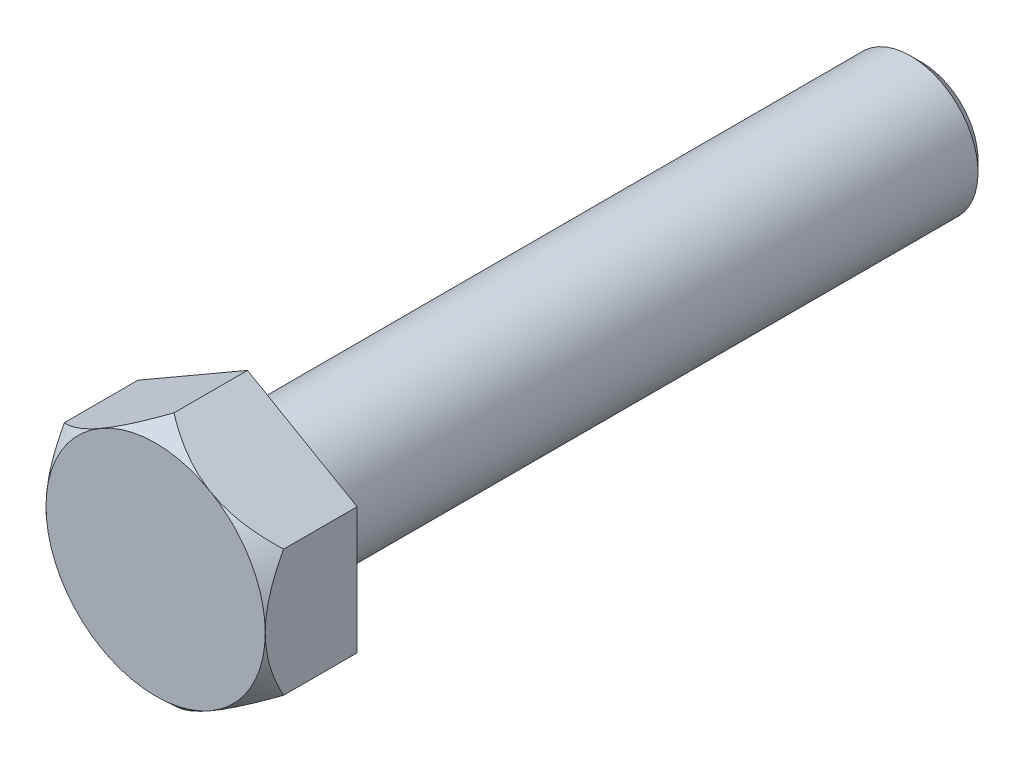
ISO-10303-21;
HEADER;
FILE_DESCRIPTION(('STEP AP214'),'2;1');
FILE_NAME('part.step','',(''),(''),'','','');
FILE_SCHEMA(('AUTOMOTIVE_DESIGN { 1 0 10303 214 1 1 1 1 }'));
ENDSEC;
DATA;
#1=APPLICATION_CONTEXT('core data for automotive mechanical design processes');
#2=APPLICATION_PROTOCOL_DEFINITION('international standard','automotive_design',2000,#1);
#3=PRODUCT_CONTEXT('',#1,'mechanical');
#4=PRODUCT('Part','Part','',(#3));
#5=PRODUCT_RELATED_PRODUCT_CATEGORY('part','',(#4));
#6=PRODUCT_DEFINITION_FORMATION('','',#4);
#7=PRODUCT_DEFINITION_CONTEXT('part definition',#1,'design');
#8=PRODUCT_DEFINITION('design','',#6,#7);
#9=PRODUCT_DEFINITION_SHAPE('','',#8);
#10=(LENGTH_UNIT() NAMED_UNIT(*) SI_UNIT(.MILLI.,.METRE.));
#11=(NAMED_UNIT(*) PLANE_ANGLE_UNIT() SI_UNIT($,.RADIAN.));
#12=(NAMED_UNIT(*) SI_UNIT($,.STERADIAN.) SOLID_ANGLE_UNIT());
#13=UNCERTAINTY_MEASURE_WITH_UNIT(LENGTH_MEASURE(1.E-05),#10,'distance_accuracy_value','');
#14=(GEOMETRIC_REPRESENTATION_CONTEXT(3) GLOBAL_UNCERTAINTY_ASSIGNED_CONTEXT((#13)) GLOBAL_UNIT_ASSIGNED_CONTEXT((#10,
#11,#12)) REPRESENTATION_CONTEXT('',''));
#15=CARTESIAN_POINT('',(0.,0.,0.));
#16=DIRECTION('',(0.,0.,1.));
#17=DIRECTION('',(1.,0.,0.));
#18=AXIS2_PLACEMENT_3D('',#15,#16,#17);
#19=CARTESIAN_POINT('',(3.25,-5.62916512459885,5.45));
#20=DIRECTION('',(0.5,-0.866025403784439,0.));
#21=DIRECTION('',(0.,0.,-1.));
#22=AXIS2_PLACEMENT_3D('',#19,#20,#21);
#23=PLANE('',#22);
#24=CARTESIAN_POINT('',(6.49999393874435,-3.75278024920014,4.36));
#25=CARTESIAN_POINT('',(4.758327813034,-4.75833165571749,5.45));
#26=CARTESIAN_POINT('',(3.25,-5.62916512459885,5.45));
#27=CARTESIAN_POINT('',(1.741672186966,-6.49999859348023,5.45));
#28=CARTESIAN_POINT('',(6.06125564464485E-06,-7.50554999999756,4.36));
#29=(BOUNDED_CURVE() B_SPLINE_CURVE(2,(#24,#25,#26,#27,#28),.UNSPECIFIED.,.F.,
.F.) B_SPLINE_CURVE_WITH_KNOTS((3,2,3),(0.,3.93923247027006,7.87846494054012),
.UNSPECIFIED.) CURVE() GEOMETRIC_REPRESENTATION_ITEM() RATIONAL_B_SPLINE_CURVE((1.,
1.03795471962895,1.,1.03795471962895,1.)) REPRESENTATION_ITEM(''));
#30=CARTESIAN_POINT('',(3.25,-5.62916512459885,5.45));
#31=VERTEX_POINT('',#30);
#32=CARTESIAN_POINT('',(6.06125564912523E-06,-7.50554999999755,4.36));
#33=VERTEX_POINT('',#32);
#34=EDGE_CURVE('E245',#31,#33,#29,.T.);
#35=ORIENTED_EDGE('',*,*,#34,.T.);
#36=DIRECTION('',(0.,0.,-1.));
#37=VECTOR('',#36,1.);
#38=CARTESIAN_POINT('',(6.06125564925871E-06,-7.50554999999755,2.18));
#39=LINE('',#38,#37);
#40=CARTESIAN_POINT('',(6.06125564939219E-06,-7.50554999999755,0.));
#41=VERTEX_POINT('',#40);
#42=EDGE_CURVE('E269',#33,#41,#39,.T.);
#43=ORIENTED_EDGE('',*,*,#42,.T.);
#44=DIRECTION('',(0.866025403784439,0.5,0.));
#45=VECTOR('',#44,1.);
#46=CARTESIAN_POINT('',(4.53881359325323,-4.88506824959885,0.));
#47=LINE('',#46,#45);
#48=CARTESIAN_POINT('',(6.49999393874435,-3.75278024920014,0.));
#49=VERTEX_POINT('',#48);
#50=EDGE_CURVE('E312',#41,#49,#47,.T.);
#51=ORIENTED_EDGE('',*,*,#50,.T.);
#52=DIRECTION('',(0.,0.,1.));
#53=VECTOR('',#52,1.);
#54=CARTESIAN_POINT('',(6.49999393874435,-3.75278024920014,2.18));
#55=LINE('',#54,#53);
#56=CARTESIAN_POINT('',(6.49999393874435,-3.75278024920014,4.36));
#57=VERTEX_POINT('',#56);
#58=EDGE_CURVE('E227',#49,#57,#55,.T.);
#59=ORIENTED_EDGE('',*,*,#58,.T.);
#60=CARTESIAN_POINT('',(6.49999393874435,-3.75278024920014,4.36));
#61=CARTESIAN_POINT('',(4.758327813034,-4.75833165571749,5.45));
#62=CARTESIAN_POINT('',(3.25,-5.62916512459885,5.45));
#63=CARTESIAN_POINT('',(1.741672186966,-6.49999859348023,5.45));
#64=CARTESIAN_POINT('',(6.06125564464485E-06,-7.50554999999756,4.36));
#65=(BOUNDED_CURVE() B_SPLINE_CURVE(2,(#60,#61,#62,#63,#64),.UNSPECIFIED.,.F.,
.F.) B_SPLINE_CURVE_WITH_KNOTS((3,2,3),(0.,3.93923247027006,7.87846494054012),
.UNSPECIFIED.) CURVE() GEOMETRIC_REPRESENTATION_ITEM() RATIONAL_B_SPLINE_CURVE((1.,
1.03795471962895,1.,1.03795471962895,1.)) REPRESENTATION_ITEM(''));
#66=EDGE_CURVE('E262',#57,#31,#65,.T.);
#67=ORIENTED_EDGE('',*,*,#66,.T.);
#68=EDGE_LOOP('',(#35,#43,#51,#59,#67));
#69=FACE_BOUND('',#68,.T.);
#70=ADVANCED_FACE('F17',(#69),#23,.T.);
#71=CARTESIAN_POINT('',(6.5,0.,5.45));
#72=DIRECTION('',(1.,0.,0.));
#73=DIRECTION('',(0.,1.,0.));
#74=AXIS2_PLACEMENT_3D('',#71,#72,#73);
#75=PLANE('',#74);
#76=CARTESIAN_POINT('',(6.5,3.75276975079742,4.36));
#77=CARTESIAN_POINT('',(6.50000000000001,1.74166693776276,5.45));
#78=CARTESIAN_POINT('',(6.5,0.,5.45));
#79=CARTESIAN_POINT('',(6.5,-1.74166693776276,5.45000000000001));
#80=CARTESIAN_POINT('',(6.5,-3.75276975079742,4.36));
#81=(BOUNDED_CURVE() B_SPLINE_CURVE(2,(#76,#77,#78,#79,#80),.UNSPECIFIED.,.F.,
.F.) B_SPLINE_CURVE_WITH_KNOTS((3,2,3),(0.,3.93923247027006,7.87846494054013),
.UNSPECIFIED.) CURVE() GEOMETRIC_REPRESENTATION_ITEM() RATIONAL_B_SPLINE_CURVE((1.,
1.03795471962895,1.,1.03795471962894,1.)) REPRESENTATION_ITEM(''));
#82=CARTESIAN_POINT('',(6.5,0.,5.45));
#83=VERTEX_POINT('',#82);
#84=CARTESIAN_POINT('',(6.5,-3.75276975079741,4.36));
#85=VERTEX_POINT('',#84);
#86=EDGE_CURVE('E284',#83,#85,#81,.T.);
#87=ORIENTED_EDGE('',*,*,#86,.T.);
#88=DIRECTION('',(0.,0.,-1.));
#89=VECTOR('',#88,1.);
#90=CARTESIAN_POINT('',(6.5,-3.75276975079741,2.18));
#91=LINE('',#90,#89);
#92=CARTESIAN_POINT('',(6.5,-3.75276975079741,0.));
#93=VERTEX_POINT('',#92);
#94=EDGE_CURVE('E219',#85,#93,#91,.T.);
#95=ORIENTED_EDGE('',*,*,#94,.T.);
#96=DIRECTION('',(0.,1.,0.));
#97=VECTOR('',#96,1.);
#98=CARTESIAN_POINT('',(6.5,2.97638750000001,0.));
#99=LINE('',#98,#97);
#100=CARTESIAN_POINT('',(6.5,3.75276975079741,0.));
#101=VERTEX_POINT('',#100);
#102=EDGE_CURVE('E310',#93,#101,#99,.T.);
#103=ORIENTED_EDGE('',*,*,#102,.T.);
#104=DIRECTION('',(0.,0.,1.));
#105=VECTOR('',#104,1.);
#106=CARTESIAN_POINT('',(6.5,3.75276975079741,2.18));
#107=LINE('',#106,#105);
#108=CARTESIAN_POINT('',(6.5,3.75276975079741,4.36));
#109=VERTEX_POINT('',#108);
#110=EDGE_CURVE('E182',#101,#109,#107,.T.);
#111=ORIENTED_EDGE('',*,*,#110,.T.);
#112=CARTESIAN_POINT('',(6.5,3.75276975079742,4.36));
#113=CARTESIAN_POINT('',(6.50000000000001,1.74166693776276,5.45));
#114=CARTESIAN_POINT('',(6.5,0.,5.45));
#115=CARTESIAN_POINT('',(6.5,-1.74166693776276,5.45000000000001));
#116=CARTESIAN_POINT('',(6.5,-3.75276975079742,4.36));
#117=(BOUNDED_CURVE() B_SPLINE_CURVE(2,(#112,#113,#114,#115,#116),.UNSPECIFIED.,.F.,
.F.) B_SPLINE_CURVE_WITH_KNOTS((3,2,3),(0.,3.93923247027006,7.87846494054013),
.UNSPECIFIED.) CURVE() GEOMETRIC_REPRESENTATION_ITEM() RATIONAL_B_SPLINE_CURVE((1.,
1.03795471962895,1.,1.03795471962894,1.)) REPRESENTATION_ITEM(''));
#118=EDGE_CURVE('E171',#109,#83,#117,.T.);
#119=ORIENTED_EDGE('',*,*,#118,.T.);
#120=EDGE_LOOP('',(#87,#95,#103,#111,#119));
#121=FACE_BOUND('',#120,.T.);
#122=ADVANCED_FACE('F488',(#121),#75,.T.);
#123=CARTESIAN_POINT('',(3.25,5.62916512459885,5.45));
#124=DIRECTION('',(0.5,0.866025403784439,0.));
#125=DIRECTION('',(0.,0.,-1.));
#126=AXIS2_PLACEMENT_3D('',#123,#124,#125);
#127=PLANE('',#126);
#128=CARTESIAN_POINT('',(6.06125564416888E-06,7.50554999999756,4.36));
#129=CARTESIAN_POINT('',(1.74167218696601,6.49999859348024,5.45000000000001));
#130=CARTESIAN_POINT('',(3.25,5.62916512459885,5.45));
#131=CARTESIAN_POINT('',(4.758327813034,4.75833165571748,5.45000000000001));
#132=CARTESIAN_POINT('',(6.49999393874435,3.75278024920015,4.36));
#133=(BOUNDED_CURVE() B_SPLINE_CURVE(2,(#128,#129,#130,#131,#132),.UNSPECIFIED.,.F.,
.F.) B_SPLINE_CURVE_WITH_KNOTS((3,2,3),(0.,3.93923247027006,7.87846494054012),
.UNSPECIFIED.) CURVE() GEOMETRIC_REPRESENTATION_ITEM() RATIONAL_B_SPLINE_CURVE((1.,
1.03795471962894,1.,1.03795471962893,1.)) REPRESENTATION_ITEM(''));
#134=CARTESIAN_POINT('',(3.25,5.62916512459885,5.45));
#135=VERTEX_POINT('',#134);
#136=CARTESIAN_POINT('',(6.49999393874435,3.75278024920015,4.36));
#137=VERTEX_POINT('',#136);
#138=EDGE_CURVE('E160',#135,#137,#133,.T.);
#139=ORIENTED_EDGE('',*,*,#138,.T.);
#140=DIRECTION('',(0.,0.,-1.));
#141=VECTOR('',#140,1.);
#142=CARTESIAN_POINT('',(6.49999393874435,3.75278024920015,2.18));
#143=LINE('',#142,#141);
#144=CARTESIAN_POINT('',(6.49999393874435,3.75278024920015,0.));
#145=VERTEX_POINT('',#144);
#146=EDGE_CURVE('E164',#137,#145,#143,.T.);
#147=ORIENTED_EDGE('',*,*,#146,.T.);
#148=DIRECTION('',(-0.866025403784439,0.5,0.));
#149=VECTOR('',#148,1.);
#150=CARTESIAN_POINT('',(1.96118640674677,6.37326199959885,0.));
#151=LINE('',#150,#149);
#152=CARTESIAN_POINT('',(6.06125564717175E-06,7.50554999999755,0.));
#153=VERTEX_POINT('',#152);
#154=EDGE_CURVE('E244',#145,#153,#151,.T.);
#155=ORIENTED_EDGE('',*,*,#154,.T.);
#156=DIRECTION('',(0.,0.,1.));
#157=VECTOR('',#156,1.);
#158=CARTESIAN_POINT('',(6.06125564703827E-06,7.50554999999755,2.18));
#159=LINE('',#158,#157);
#160=CARTESIAN_POINT('',(6.06125564690478E-06,7.50554999999755,4.36));
#161=VERTEX_POINT('',#160);
#162=EDGE_CURVE('E397',#153,#161,#159,.T.);
#163=ORIENTED_EDGE('',*,*,#162,.T.);
#164=CARTESIAN_POINT('',(6.06125564416888E-06,7.50554999999756,4.36));
#165=CARTESIAN_POINT('',(1.74167218696601,6.49999859348024,5.45000000000001));
#166=CARTESIAN_POINT('',(3.25,5.62916512459885,5.45));
#167=CARTESIAN_POINT('',(4.758327813034,4.75833165571748,5.45000000000001));
#168=CARTESIAN_POINT('',(6.49999393874435,3.75278024920015,4.36));
#169=(BOUNDED_CURVE() B_SPLINE_CURVE(2,(#164,#165,#166,#167,#168),.UNSPECIFIED.,.F.,
.F.) B_SPLINE_CURVE_WITH_KNOTS((3,2,3),(0.,3.93923247027006,7.87846494054012),
.UNSPECIFIED.) CURVE() GEOMETRIC_REPRESENTATION_ITEM() RATIONAL_B_SPLINE_CURVE((1.,
1.03795471962894,1.,1.03795471962893,1.)) REPRESENTATION_ITEM(''));
#170=EDGE_CURVE('E166',#161,#135,#169,.T.);
#171=ORIENTED_EDGE('',*,*,#170,.T.);
#172=EDGE_LOOP('',(#139,#147,#155,#163,#171));
#173=FACE_BOUND('',#172,.T.);
#174=ADVANCED_FACE('F162',(#173),#127,.T.);
#175=CARTESIAN_POINT('',(-3.25,5.62916512459885,5.45));
#176=DIRECTION('',(-0.5,0.866025403784439,0.));
#177=DIRECTION('',(0.,0.,1.));
#178=AXIS2_PLACEMENT_3D('',#175,#176,#177);
#179=PLANE('',#178);
#180=CARTESIAN_POINT('',(-6.49999393874436,3.75278024920014,4.36));
#181=CARTESIAN_POINT('',(-4.75832781303399,4.75833165571747,5.45));
#182=CARTESIAN_POINT('',(-3.25,5.62916512459885,5.45));
#183=CARTESIAN_POINT('',(-1.741672186966,6.49999859348023,5.45));
#184=CARTESIAN_POINT('',(-6.06125564803462E-06,7.50554999999756,4.36));
#185=(BOUNDED_CURVE() B_SPLINE_CURVE(2,(#180,#181,#182,#183,#184),.UNSPECIFIED.,.F.,
.F.) B_SPLINE_CURVE_WITH_KNOTS((3,2,3),(0.,3.93923247027006,7.87846494054012),
.UNSPECIFIED.) CURVE() GEOMETRIC_REPRESENTATION_ITEM() RATIONAL_B_SPLINE_CURVE((1.,
1.03795471962896,1.,1.03795471962895,1.)) REPRESENTATION_ITEM(''));
#186=CARTESIAN_POINT('',(-3.25,5.62916512459885,5.45));
#187=VERTEX_POINT('',#186);
#188=CARTESIAN_POINT('',(-6.06125565143552E-06,7.50554999999755,4.36));
#189=VERTEX_POINT('',#188);
#190=EDGE_CURVE('E351',#187,#189,#185,.T.);
#191=ORIENTED_EDGE('',*,*,#190,.T.);
#192=DIRECTION('',(0.,0.,-1.));
#193=VECTOR('',#192,1.);
#194=CARTESIAN_POINT('',(-6.06125565130203E-06,7.50554999999755,2.18));
#195=LINE('',#194,#193);
#196=CARTESIAN_POINT('',(-6.06125565116855E-06,7.50554999999755,0.));
#197=VERTEX_POINT('',#196);
#198=EDGE_CURVE('E325',#189,#197,#195,.T.);
#199=ORIENTED_EDGE('',*,*,#198,.T.);
#200=DIRECTION('',(-0.866025403784439,-0.5,0.));
#201=VECTOR('',#200,1.);
#202=CARTESIAN_POINT('',(-1.96118640674677,6.37326199959885,0.));
#203=LINE('',#202,#201);
#204=CARTESIAN_POINT('',(-6.49999393874435,3.75278024920014,0.));
#205=VERTEX_POINT('',#204);
#206=EDGE_CURVE('E11',#197,#205,#203,.T.);
#207=ORIENTED_EDGE('',*,*,#206,.T.);
#208=DIRECTION('',(0.,0.,1.));
#209=VECTOR('',#208,1.);
#210=CARTESIAN_POINT('',(-6.49999393874435,3.75278024920014,2.18));
#211=LINE('',#210,#209);
#212=CARTESIAN_POINT('',(-6.49999393874435,3.75278024920014,4.36));
#213=VERTEX_POINT('',#212);
#214=EDGE_CURVE('E214',#205,#213,#211,.T.);
#215=ORIENTED_EDGE('',*,*,#214,.T.);
#216=CARTESIAN_POINT('',(-6.49999393874436,3.75278024920014,4.36));
#217=CARTESIAN_POINT('',(-4.75832781303399,4.75833165571747,5.45));
#218=CARTESIAN_POINT('',(-3.25,5.62916512459885,5.45));
#219=CARTESIAN_POINT('',(-1.741672186966,6.49999859348023,5.45));
#220=CARTESIAN_POINT('',(-6.06125564803462E-06,7.50554999999756,4.36));
#221=(BOUNDED_CURVE() B_SPLINE_CURVE(2,(#216,#217,#218,#219,#220),.UNSPECIFIED.,.F.,
.F.) B_SPLINE_CURVE_WITH_KNOTS((3,2,3),(0.,3.93923247027006,7.87846494054012),
.UNSPECIFIED.) CURVE() GEOMETRIC_REPRESENTATION_ITEM() RATIONAL_B_SPLINE_CURVE((1.,
1.03795471962896,1.,1.03795471962895,1.)) REPRESENTATION_ITEM(''));
#222=EDGE_CURVE('E289',#213,#187,#221,.T.);
#223=ORIENTED_EDGE('',*,*,#222,.T.);
#224=EDGE_LOOP('',(#191,#199,#207,#215,#223));
#225=FACE_BOUND('',#224,.T.);
#226=ADVANCED_FACE('F459',(#225),#179,.T.);
#227=CARTESIAN_POINT('',(-6.5,0.,5.45));
#228=DIRECTION('',(-1.,0.,0.));
#229=DIRECTION('',(0.,0.,1.));
#230=AXIS2_PLACEMENT_3D('',#227,#228,#229);
#231=PLANE('',#230);
#232=CARTESIAN_POINT('',(-6.5,-3.75276975079741,4.36));
#233=CARTESIAN_POINT('',(-6.49999999999999,-1.74166693776275,5.45000000000001));
#234=CARTESIAN_POINT('',(-6.5,0.,5.45));
#235=CARTESIAN_POINT('',(-6.49999999999999,1.74166693776275,5.45000000000001));
#236=CARTESIAN_POINT('',(-6.5,3.75276975079741,4.36));
#237=(BOUNDED_CURVE() B_SPLINE_CURVE(2,(#232,#233,#234,#235,#236),.UNSPECIFIED.,.F.,
.F.) B_SPLINE_CURVE_WITH_KNOTS((3,2,3),(0.,3.93923247027006,7.87846494054012),
.UNSPECIFIED.) CURVE() GEOMETRIC_REPRESENTATION_ITEM() RATIONAL_B_SPLINE_CURVE((1.,
1.03795471962894,1.,1.03795471962894,1.)) REPRESENTATION_ITEM(''));
#238=CARTESIAN_POINT('',(-6.5,0.,5.45));
#239=VERTEX_POINT('',#238);
#240=CARTESIAN_POINT('',(-6.5,3.75276975079741,4.36));
#241=VERTEX_POINT('',#240);
#242=EDGE_CURVE('E339',#239,#241,#237,.T.);
#243=ORIENTED_EDGE('',*,*,#242,.T.);
#244=DIRECTION('',(0.,0.,-1.));
#245=VECTOR('',#244,1.);
#246=CARTESIAN_POINT('',(-6.5,3.75276975079741,2.18));
#247=LINE('',#246,#245);
#248=CARTESIAN_POINT('',(-6.5,3.75276975079741,0.));
#249=VERTEX_POINT('',#248);
#250=EDGE_CURVE('E206',#241,#249,#247,.T.);
#251=ORIENTED_EDGE('',*,*,#250,.T.);
#252=DIRECTION('',(0.,-1.,0.));
#253=VECTOR('',#252,1.);
#254=CARTESIAN_POINT('',(-6.5,2.9763875,0.));
#255=LINE('',#254,#253);
#256=CARTESIAN_POINT('',(-6.5,-3.75276975079741,0.));
#257=VERTEX_POINT('',#256);
#258=EDGE_CURVE('E25',#249,#257,#255,.T.);
#259=ORIENTED_EDGE('',*,*,#258,.T.);
#260=DIRECTION('',(0.,0.,1.));
#261=VECTOR('',#260,1.);
#262=CARTESIAN_POINT('',(-6.5,-3.75276975079741,2.18));
#263=LINE('',#262,#261);
#264=CARTESIAN_POINT('',(-6.5,-3.75276975079741,4.36));
#265=VERTEX_POINT('',#264);
#266=EDGE_CURVE('E235',#257,#265,#263,.T.);
#267=ORIENTED_EDGE('',*,*,#266,.T.);
#268=CARTESIAN_POINT('',(-6.5,-3.75276975079741,4.36));
#269=CARTESIAN_POINT('',(-6.49999999999999,-1.74166693776275,5.45000000000001));
#270=CARTESIAN_POINT('',(-6.5,0.,5.45));
#271=CARTESIAN_POINT('',(-6.49999999999999,1.74166693776275,5.45000000000001));
#272=CARTESIAN_POINT('',(-6.5,3.75276975079741,4.36));
#273=(BOUNDED_CURVE() B_SPLINE_CURVE(2,(#268,#269,#270,#271,#272),.UNSPECIFIED.,.F.,
.F.) B_SPLINE_CURVE_WITH_KNOTS((3,2,3),(0.,3.93923247027006,7.87846494054012),
.UNSPECIFIED.) CURVE() GEOMETRIC_REPRESENTATION_ITEM() RATIONAL_B_SPLINE_CURVE((1.,
1.03795471962894,1.,1.03795471962894,1.)) REPRESENTATION_ITEM(''));
#274=EDGE_CURVE('E256',#265,#239,#273,.T.);
#275=ORIENTED_EDGE('',*,*,#274,.T.);
#276=EDGE_LOOP('',(#243,#251,#259,#267,#275));
#277=FACE_BOUND('',#276,.T.);
#278=ADVANCED_FACE('F468',(#277),#231,.T.);
#279=CARTESIAN_POINT('',(-3.25,-5.62916512459885,5.45));
#280=DIRECTION('',(-0.5,-0.866025403784439,0.));
#281=DIRECTION('',(-0.866025403784439,0.5,0.));
#282=AXIS2_PLACEMENT_3D('',#279,#280,#281);
#283=PLANE('',#282);
#284=CARTESIAN_POINT('',(-6.06125564089502E-06,-7.50554999999756,4.36));
#285=CARTESIAN_POINT('',(-1.741672186966,-6.49999859348023,5.45));
#286=CARTESIAN_POINT('',(-3.25,-5.62916512459885,5.45));
#287=CARTESIAN_POINT('',(-4.758327813034,-4.75833165571747,5.45));
#288=CARTESIAN_POINT('',(-6.49999393874436,-3.75278024920014,4.36));
#289=(BOUNDED_CURVE() B_SPLINE_CURVE(2,(#284,#285,#286,#287,#288),.UNSPECIFIED.,.F.,
.F.) B_SPLINE_CURVE_WITH_KNOTS((3,2,3),(0.,3.93923247027006,7.87846494054013),
.UNSPECIFIED.) CURVE() GEOMETRIC_REPRESENTATION_ITEM() RATIONAL_B_SPLINE_CURVE((1.,
1.03795471962893,1.,1.03795471962894,1.)) REPRESENTATION_ITEM(''));
#290=CARTESIAN_POINT('',(-3.25,-5.62916512459885,5.45));
#291=VERTEX_POINT('',#290);
#292=CARTESIAN_POINT('',(-6.49999393874435,-3.75278024920015,4.36));
#293=VERTEX_POINT('',#292);
#294=EDGE_CURVE('E261',#291,#293,#289,.T.);
#295=ORIENTED_EDGE('',*,*,#294,.T.);
#296=DIRECTION('',(0.,0.,-1.));
#297=VECTOR('',#296,1.);
#298=CARTESIAN_POINT('',(-6.49999393874435,-3.75278024920015,2.18));
#299=LINE('',#298,#297);
#300=CARTESIAN_POINT('',(-6.49999393874435,-3.75278024920015,0.));
#301=VERTEX_POINT('',#300);
#302=EDGE_CURVE('E252',#293,#301,#299,.T.);
#303=ORIENTED_EDGE('',*,*,#302,.T.);
#304=DIRECTION('',(0.866025403784439,-0.5,0.));
#305=VECTOR('',#304,1.);
#306=CARTESIAN_POINT('',(-4.53881359325323,-4.88506824959885,0.));
#307=LINE('',#306,#305);
#308=CARTESIAN_POINT('',(-6.06125564805993E-06,-7.50554999999756,0.));
#309=VERTEX_POINT('',#308);
#310=EDGE_CURVE('E37',#301,#309,#307,.T.);
#311=ORIENTED_EDGE('',*,*,#310,.T.);
#312=DIRECTION('',(0.,0.,1.));
#313=VECTOR('',#312,1.);
#314=CARTESIAN_POINT('',(-6.06125564819341E-06,-7.50554999999756,2.18));
#315=LINE('',#314,#313);
#316=CARTESIAN_POINT('',(-6.06125564832689E-06,-7.50554999999756,4.36));
#317=VERTEX_POINT('',#316);
#318=EDGE_CURVE('E277',#309,#317,#315,.T.);
#319=ORIENTED_EDGE('',*,*,#318,.T.);
#320=CARTESIAN_POINT('',(-6.06125564089502E-06,-7.50554999999756,4.36));
#321=CARTESIAN_POINT('',(-1.741672186966,-6.49999859348023,5.45));
#322=CARTESIAN_POINT('',(-3.25,-5.62916512459885,5.45));
#323=CARTESIAN_POINT('',(-4.758327813034,-4.75833165571747,5.45));
#324=CARTESIAN_POINT('',(-6.49999393874436,-3.75278024920014,4.36));
#325=(BOUNDED_CURVE() B_SPLINE_CURVE(2,(#320,#321,#322,#323,#324),.UNSPECIFIED.,.F.,
.F.) B_SPLINE_CURVE_WITH_KNOTS((3,2,3),(0.,3.93923247027006,7.87846494054013),
.UNSPECIFIED.) CURVE() GEOMETRIC_REPRESENTATION_ITEM() RATIONAL_B_SPLINE_CURVE((1.,
1.03795471962893,1.,1.03795471962894,1.)) REPRESENTATION_ITEM(''));
#326=EDGE_CURVE('E47',#317,#291,#325,.T.);
#327=ORIENTED_EDGE('',*,*,#326,.T.);
#328=EDGE_LOOP('',(#295,#303,#311,#319,#327));
#329=FACE_BOUND('',#328,.T.);
#330=ADVANCED_FACE('F449',(#329),#283,.T.);
#331=CARTESIAN_POINT('',(0.,5.952775,0.));
#332=DIRECTION('',(0.,0.,-1.));
#333=DIRECTION('',(0.,-1.,0.));
#334=AXIS2_PLACEMENT_3D('',#331,#332,#333);
#335=PLANE('',#334);
#336=CARTESIAN_POINT('',(0.,0.,0.));
#337=DIRECTION('',(0.,0.,-1.));
#338=DIRECTION('',(0.,1.,0.));
#339=AXIS2_PLACEMENT_3D('',#336,#337,#338);
#340=CIRCLE('',#339,4.4);
#341=CARTESIAN_POINT('',(0.,4.4,0.));
#342=VERTEX_POINT('',#341);
#343=EDGE_CURVE('E399',#342,#342,#340,.T.);
#344=ORIENTED_EDGE('',*,*,#343,.F.);
#345=EDGE_LOOP('',(#344));
#346=FACE_BOUND('',#345,.T.);
#347=ORIENTED_EDGE('',*,*,#154,.F.);
#348=CARTESIAN_POINT('',(0.,0.,0.));
#349=DIRECTION('',(0.,0.,-1.));
#350=DIRECTION('',(0.,1.,0.));
#351=AXIS2_PLACEMENT_3D('',#348,#349,#350);
#352=CIRCLE('',#351,7.50555);
#353=EDGE_CURVE('E187',#145,#101,#352,.T.);
#354=ORIENTED_EDGE('',*,*,#353,.T.);
#355=ORIENTED_EDGE('',*,*,#102,.F.);
#356=CARTESIAN_POINT('',(0.,0.,0.));
#357=DIRECTION('',(0.,0.,-1.));
#358=DIRECTION('',(0.,1.,0.));
#359=AXIS2_PLACEMENT_3D('',#356,#357,#358);
#360=CIRCLE('',#359,7.50555);
#361=EDGE_CURVE('E231',#93,#49,#360,.T.);
#362=ORIENTED_EDGE('',*,*,#361,.T.);
#363=ORIENTED_EDGE('',*,*,#50,.F.);
#364=CARTESIAN_POINT('',(0.,0.,0.));
#365=DIRECTION('',(0.,0.,-1.));
#366=DIRECTION('',(0.,1.,0.));
#367=AXIS2_PLACEMENT_3D('',#364,#365,#366);
#368=CIRCLE('',#367,7.50555);
#369=EDGE_CURVE('E172',#41,#309,#368,.T.);
#370=ORIENTED_EDGE('',*,*,#369,.T.);
#371=ORIENTED_EDGE('',*,*,#310,.F.);
#372=CARTESIAN_POINT('',(0.,0.,0.));
#373=DIRECTION('',(0.,0.,-1.));
#374=DIRECTION('',(0.,1.,0.));
#375=AXIS2_PLACEMENT_3D('',#372,#373,#374);
#376=CIRCLE('',#375,7.50555);
#377=EDGE_CURVE('E239',#301,#257,#376,.T.);
#378=ORIENTED_EDGE('',*,*,#377,.T.);
#379=ORIENTED_EDGE('',*,*,#258,.F.);
#380=CARTESIAN_POINT('',(0.,0.,0.));
#381=DIRECTION('',(0.,0.,-1.));
#382=DIRECTION('',(0.,1.,0.));
#383=AXIS2_PLACEMENT_3D('',#380,#381,#382);
#384=CIRCLE('',#383,7.50555);
#385=EDGE_CURVE('E218',#249,#205,#384,.T.);
#386=ORIENTED_EDGE('',*,*,#385,.T.);
#387=ORIENTED_EDGE('',*,*,#206,.F.);
#388=CARTESIAN_POINT('',(0.,0.,0.));
#389=DIRECTION('',(0.,0.,-1.));
#390=DIRECTION('',(0.,1.,0.));
#391=AXIS2_PLACEMENT_3D('',#388,#389,#390);
#392=CIRCLE('',#391,7.50555);
#393=EDGE_CURVE('E323',#197,#153,#392,.T.);
#394=ORIENTED_EDGE('',*,*,#393,.T.);
#395=EDGE_LOOP('',(#347,#354,#355,#362,#363,#370,#371,#378,#379,#386,#387,#394));
#396=FACE_BOUND('',#395,.T.);
#397=ADVANCED_FACE('F445',(#346,#396),#335,.T.);
#398=CARTESIAN_POINT('',(0.,0.,4.905));
#399=DIRECTION('',(0.,0.,-1.));
#400=DIRECTION('',(0.,1.,0.));
#401=AXIS2_PLACEMENT_3D('',#398,#399,#400);
#402=CONICAL_SURFACE('',#401,7.002775,0.745120275929383);
#403=ORIENTED_EDGE('',*,*,#34,.F.);
#404=CARTESIAN_POINT('',(0.,0.,5.45));
#405=DIRECTION('',(0.,0.,-1.));
#406=DIRECTION('',(0.,1.,0.));
#407=AXIS2_PLACEMENT_3D('',#404,#405,#406);
#408=CIRCLE('',#407,6.5);
#409=EDGE_CURVE('E332',#31,#291,#408,.T.);
#410=ORIENTED_EDGE('',*,*,#409,.T.);
#411=ORIENTED_EDGE('',*,*,#326,.F.);
#412=CARTESIAN_POINT('',(0.,0.,4.36));
#413=DIRECTION('',(0.,0.,-1.));
#414=DIRECTION('',(0.,1.,0.));
#415=AXIS2_PLACEMENT_3D('',#412,#413,#414);
#416=CIRCLE('',#415,7.50555);
#417=EDGE_CURVE('E273',#33,#317,#416,.T.);
#418=ORIENTED_EDGE('',*,*,#417,.F.);
#419=EDGE_LOOP('',(#403,#410,#411,#418));
#420=FACE_BOUND('',#419,.T.);
#421=ADVANCED_FACE('F448',(#420),#402,.T.);
#422=CARTESIAN_POINT('',(0.,0.,4.905));
#423=DIRECTION('',(0.,0.,-1.));
#424=DIRECTION('',(0.,1.,0.));
#425=AXIS2_PLACEMENT_3D('',#422,#423,#424);
#426=CONICAL_SURFACE('',#425,7.002775,0.745120275929383);
#427=ORIENTED_EDGE('',*,*,#274,.F.);
#428=CARTESIAN_POINT('',(0.,0.,4.36));
#429=DIRECTION('',(0.,0.,-1.));
#430=DIRECTION('',(0.,1.,0.));
#431=AXIS2_PLACEMENT_3D('',#428,#429,#430);
#432=CIRCLE('',#431,7.50555);
#433=EDGE_CURVE('E255',#293,#265,#432,.T.);
#434=ORIENTED_EDGE('',*,*,#433,.F.);
#435=ORIENTED_EDGE('',*,*,#294,.F.);
#436=CARTESIAN_POINT('',(0.,0.,5.45));
#437=DIRECTION('',(0.,0.,-1.));
#438=DIRECTION('',(0.,1.,0.));
#439=AXIS2_PLACEMENT_3D('',#436,#437,#438);
#440=CIRCLE('',#439,6.5);
#441=EDGE_CURVE('E357',#291,#239,#440,.T.);
#442=ORIENTED_EDGE('',*,*,#441,.T.);
#443=EDGE_LOOP('',(#427,#434,#435,#442));
#444=FACE_BOUND('',#443,.T.);
#445=ADVANCED_FACE('F472',(#444),#426,.T.);
#446=CARTESIAN_POINT('',(0.,0.,4.905));
#447=DIRECTION('',(0.,0.,-1.));
#448=DIRECTION('',(0.,1.,0.));
#449=AXIS2_PLACEMENT_3D('',#446,#447,#448);
#450=CONICAL_SURFACE('',#449,7.002775,0.745120275929383);
#451=ORIENTED_EDGE('',*,*,#86,.F.);
#452=CARTESIAN_POINT('',(0.,0.,5.45));
#453=DIRECTION('',(0.,0.,-1.));
#454=DIRECTION('',(0.,1.,0.));
#455=AXIS2_PLACEMENT_3D('',#452,#453,#454);
#456=CIRCLE('',#455,6.5);
#457=EDGE_CURVE('E193',#83,#31,#456,.T.);
#458=ORIENTED_EDGE('',*,*,#457,.T.);
#459=ORIENTED_EDGE('',*,*,#66,.F.);
#460=CARTESIAN_POINT('',(0.,0.,4.36));
#461=DIRECTION('',(0.,0.,-1.));
#462=DIRECTION('',(0.,1.,0.));
#463=AXIS2_PLACEMENT_3D('',#460,#461,#462);
#464=CIRCLE('',#463,7.50555);
#465=EDGE_CURVE('E223',#85,#57,#464,.T.);
#466=ORIENTED_EDGE('',*,*,#465,.F.);
#467=EDGE_LOOP('',(#451,#458,#459,#466));
#468=FACE_BOUND('',#467,.T.);
#469=ADVANCED_FACE('F484',(#468),#450,.T.);
#470=CARTESIAN_POINT('',(0.,0.,4.905));
#471=DIRECTION('',(0.,0.,-1.));
#472=DIRECTION('',(0.,1.,0.));
#473=AXIS2_PLACEMENT_3D('',#470,#471,#472);
#474=CONICAL_SURFACE('',#473,7.002775,0.745120275929383);
#475=ORIENTED_EDGE('',*,*,#242,.F.);
#476=CARTESIAN_POINT('',(0.,0.,5.45));
#477=DIRECTION('',(0.,0.,-1.));
#478=DIRECTION('',(0.,1.,0.));
#479=AXIS2_PLACEMENT_3D('',#476,#477,#478);
#480=CIRCLE('',#479,6.5);
#481=EDGE_CURVE('E376',#239,#187,#480,.T.);
#482=ORIENTED_EDGE('',*,*,#481,.T.);
#483=ORIENTED_EDGE('',*,*,#222,.F.);
#484=CARTESIAN_POINT('',(0.,0.,4.36));
#485=DIRECTION('',(0.,0.,-1.));
#486=DIRECTION('',(0.,1.,0.));
#487=AXIS2_PLACEMENT_3D('',#484,#485,#486);
#488=CIRCLE('',#487,7.50555);
#489=EDGE_CURVE('E210',#241,#213,#488,.T.);
#490=ORIENTED_EDGE('',*,*,#489,.F.);
#491=EDGE_LOOP('',(#475,#482,#483,#490));
#492=FACE_BOUND('',#491,.T.);
#493=ADVANCED_FACE('F462',(#492),#474,.T.);
#494=CARTESIAN_POINT('',(0.,0.,4.905));
#495=DIRECTION('',(0.,0.,-1.));
#496=DIRECTION('',(0.,1.,0.));
#497=AXIS2_PLACEMENT_3D('',#494,#495,#496);
#498=CONICAL_SURFACE('',#497,7.002775,0.745120275929383);
#499=ORIENTED_EDGE('',*,*,#138,.F.);
#500=CARTESIAN_POINT('',(0.,0.,5.45));
#501=DIRECTION('',(0.,0.,-1.));
#502=DIRECTION('',(0.,1.,0.));
#503=AXIS2_PLACEMENT_3D('',#500,#501,#502);
#504=CIRCLE('',#503,6.5);
#505=EDGE_CURVE('E189',#135,#83,#504,.T.);
#506=ORIENTED_EDGE('',*,*,#505,.T.);
#507=ORIENTED_EDGE('',*,*,#118,.F.);
#508=CARTESIAN_POINT('',(0.,0.,4.36));
#509=DIRECTION('',(0.,0.,-1.));
#510=DIRECTION('',(0.,1.,0.));
#511=AXIS2_PLACEMENT_3D('',#508,#509,#510);
#512=CIRCLE('',#511,7.50555);
#513=EDGE_CURVE('E175',#137,#109,#512,.T.);
#514=ORIENTED_EDGE('',*,*,#513,.F.);
#515=EDGE_LOOP('',(#499,#506,#507,#514));
#516=FACE_BOUND('',#515,.T.);
#517=ADVANCED_FACE('F176',(#516),#498,.T.);
#518=CARTESIAN_POINT('',(0.,0.,2.18));
#519=DIRECTION('',(0.,0.,1.));
#520=DIRECTION('',(0.,1.,0.));
#521=AXIS2_PLACEMENT_3D('',#518,#519,#520);
#522=CYLINDRICAL_SURFACE('',#521,7.50555);
#523=ORIENTED_EDGE('',*,*,#42,.F.);
#524=ORIENTED_EDGE('',*,*,#417,.T.);
#525=ORIENTED_EDGE('',*,*,#318,.F.);
#526=ORIENTED_EDGE('',*,*,#369,.F.);
#527=EDGE_LOOP('',(#523,#524,#525,#526));
#528=FACE_BOUND('',#527,.T.);
#529=ADVANCED_FACE('F497',(#528),#522,.T.);
#530=CARTESIAN_POINT('',(0.,0.,2.18));
#531=DIRECTION('',(0.,0.,1.));
#532=DIRECTION('',(0.,1.,0.));
#533=AXIS2_PLACEMENT_3D('',#530,#531,#532);
#534=CYLINDRICAL_SURFACE('',#533,7.50555);
#535=ORIENTED_EDGE('',*,*,#266,.F.);
#536=ORIENTED_EDGE('',*,*,#377,.F.);
#537=ORIENTED_EDGE('',*,*,#302,.F.);
#538=ORIENTED_EDGE('',*,*,#433,.T.);
#539=EDGE_LOOP('',(#535,#536,#537,#538));
#540=FACE_BOUND('',#539,.T.);
#541=ADVANCED_FACE('F477',(#540),#534,.T.);
#542=CARTESIAN_POINT('',(0.,0.,2.18));
#543=DIRECTION('',(0.,0.,1.));
#544=DIRECTION('',(0.,1.,0.));
#545=AXIS2_PLACEMENT_3D('',#542,#543,#544);
#546=CYLINDRICAL_SURFACE('',#545,7.50555);
#547=ORIENTED_EDGE('',*,*,#94,.F.);
#548=ORIENTED_EDGE('',*,*,#465,.T.);
#549=ORIENTED_EDGE('',*,*,#58,.F.);
#550=ORIENTED_EDGE('',*,*,#361,.F.);
#551=EDGE_LOOP('',(#547,#548,#549,#550));
#552=FACE_BOUND('',#551,.T.);
#553=ADVANCED_FACE('F492',(#552),#546,.T.);
#554=CARTESIAN_POINT('',(0.,0.,2.18));
#555=DIRECTION('',(0.,0.,1.));
#556=DIRECTION('',(0.,1.,0.));
#557=AXIS2_PLACEMENT_3D('',#554,#555,#556);
#558=CYLINDRICAL_SURFACE('',#557,7.50555);
#559=ORIENTED_EDGE('',*,*,#250,.F.);
#560=ORIENTED_EDGE('',*,*,#489,.T.);
#561=ORIENTED_EDGE('',*,*,#214,.F.);
#562=ORIENTED_EDGE('',*,*,#385,.F.);
#563=EDGE_LOOP('',(#559,#560,#561,#562));
#564=FACE_BOUND('',#563,.T.);
#565=ADVANCED_FACE('F466',(#564),#558,.T.);
#566=CARTESIAN_POINT('',(0.,0.,2.18));
#567=DIRECTION('',(0.,0.,1.));
#568=DIRECTION('',(0.,1.,0.));
#569=AXIS2_PLACEMENT_3D('',#566,#567,#568);
#570=CYLINDRICAL_SURFACE('',#569,7.50555);
#571=ORIENTED_EDGE('',*,*,#146,.F.);
#572=ORIENTED_EDGE('',*,*,#513,.T.);
#573=ORIENTED_EDGE('',*,*,#110,.F.);
#574=ORIENTED_EDGE('',*,*,#353,.F.);
#575=EDGE_LOOP('',(#571,#572,#573,#574));
#576=FACE_BOUND('',#575,.T.);
#577=ADVANCED_FACE('F185',(#576),#570,.T.);
#578=CARTESIAN_POINT('',(0.,3.25,5.45));
#579=DIRECTION('',(0.,0.,1.));
#580=DIRECTION('',(0.,-1.,0.));
#581=AXIS2_PLACEMENT_3D('',#578,#579,#580);
#582=PLANE('',#581);
#583=CARTESIAN_POINT('',(0.,0.,5.45));
#584=DIRECTION('',(0.,0.,-1.));
#585=DIRECTION('',(0.,1.,0.));
#586=AXIS2_PLACEMENT_3D('',#583,#584,#585);
#587=CIRCLE('',#586,6.5);
#588=EDGE_CURVE('E369',#187,#135,#587,.T.);
#589=ORIENTED_EDGE('',*,*,#588,.F.);
#590=ORIENTED_EDGE('',*,*,#481,.F.);
#591=ORIENTED_EDGE('',*,*,#441,.F.);
#592=ORIENTED_EDGE('',*,*,#409,.F.);
#593=ORIENTED_EDGE('',*,*,#457,.F.);
#594=ORIENTED_EDGE('',*,*,#505,.F.);
#595=EDGE_LOOP('',(#589,#590,#591,#592,#593,#594));
#596=FACE_BOUND('',#595,.T.);
#597=ADVANCED_FACE('F482',(#596),#582,.T.);
#598=CARTESIAN_POINT('',(0.,0.,4.905));
#599=DIRECTION('',(0.,0.,-1.));
#600=DIRECTION('',(0.,1.,0.));
#601=AXIS2_PLACEMENT_3D('',#598,#599,#600);
#602=CONICAL_SURFACE('',#601,7.002775,0.745120275929383);
#603=ORIENTED_EDGE('',*,*,#170,.F.);
#604=CARTESIAN_POINT('',(0.,0.,4.36));
#605=DIRECTION('',(0.,0.,-1.));
#606=DIRECTION('',(0.,1.,0.));
#607=AXIS2_PLACEMENT_3D('',#604,#605,#606);
#608=CIRCLE('',#607,7.50555);
#609=EDGE_CURVE('E328',#189,#161,#608,.T.);
#610=ORIENTED_EDGE('',*,*,#609,.F.);
#611=ORIENTED_EDGE('',*,*,#190,.F.);
#612=ORIENTED_EDGE('',*,*,#588,.T.);
#613=EDGE_LOOP('',(#603,#610,#611,#612));
#614=FACE_BOUND('',#613,.T.);
#615=ADVANCED_FACE('F457',(#614),#602,.T.);
#616=CARTESIAN_POINT('',(0.,0.,2.18));
#617=DIRECTION('',(0.,0.,1.));
#618=DIRECTION('',(0.,1.,0.));
#619=AXIS2_PLACEMENT_3D('',#616,#617,#618);
#620=CYLINDRICAL_SURFACE('',#619,7.50555);
#621=ORIENTED_EDGE('',*,*,#162,.F.);
#622=ORIENTED_EDGE('',*,*,#393,.F.);
#623=ORIENTED_EDGE('',*,*,#198,.F.);
#624=ORIENTED_EDGE('',*,*,#609,.T.);
#625=EDGE_LOOP('',(#621,#622,#623,#624));
#626=FACE_BOUND('',#625,.T.);
#627=ADVANCED_FACE('F441',(#626),#620,.T.);
#628=CARTESIAN_POINT('',(0.,0.,-0.4));
#629=DIRECTION('',(0.,0.,-1.));
#630=DIRECTION('',(-1.,0.,0.));
#631=AXIS2_PLACEMENT_3D('',#628,#629,#630);
#632=TOROIDAL_SURFACE('',#631,4.4,0.4);
#633=CARTESIAN_POINT('',(0.,0.,-0.4));
#634=DIRECTION('',(0.,0.,-1.));
#635=DIRECTION('',(0.,1.,0.));
#636=AXIS2_PLACEMENT_3D('',#633,#634,#635);
#637=CIRCLE('',#636,4.);
#638=CARTESIAN_POINT('',(0.,4.,-0.4));
#639=VERTEX_POINT('',#638);
#640=EDGE_CURVE('E403',#639,#639,#637,.T.);
#641=ORIENTED_EDGE('',*,*,#640,.F.);
#642=EDGE_LOOP('',(#641));
#643=FACE_BOUND('',#642,.T.);
#644=ORIENTED_EDGE('',*,*,#343,.T.);
#645=EDGE_LOOP('',(#644));
#646=FACE_BOUND('',#645,.T.);
#647=ADVANCED_FACE('F435',(#643,#646),#632,.F.);
#648=CARTESIAN_POINT('',(0.,0.,-19.86171875));
#649=DIRECTION('',(0.,0.,1.));
#650=DIRECTION('',(0.,1.,0.));
#651=AXIS2_PLACEMENT_3D('',#648,#649,#650);
#652=CYLINDRICAL_SURFACE('',#651,4.);
#653=CARTESIAN_POINT('',(0.,0.,-39.3234375));
#654=DIRECTION('',(0.,0.,-1.));
#655=DIRECTION('',(0.,1.,0.));
#656=AXIS2_PLACEMENT_3D('',#653,#654,#655);
#657=CIRCLE('',#656,4.);
#658=CARTESIAN_POINT('',(0.,4.,-39.3234375));
#659=VERTEX_POINT('',#658);
#660=EDGE_CURVE('E414',#659,#659,#657,.T.);
#661=ORIENTED_EDGE('',*,*,#660,.F.);
#662=EDGE_LOOP('',(#661));
#663=FACE_BOUND('',#662,.T.);
#664=ORIENTED_EDGE('',*,*,#640,.T.);
#665=EDGE_LOOP('',(#664));
#666=FACE_BOUND('',#665,.T.);
#667=ADVANCED_FACE('F429',(#663,#666),#652,.T.);
#668=CARTESIAN_POINT('',(0.,0.,-39.66171875));
#669=DIRECTION('',(0.,0.,1.));
#670=DIRECTION('',(0.,1.,0.));
#671=AXIS2_PLACEMENT_3D('',#668,#669,#670);
#672=CONICAL_SURFACE('',#671,3.66171875,0.785398163397446);
#673=CARTESIAN_POINT('',(0.,0.,-40.));
#674=DIRECTION('',(0.,0.,-1.));
#675=DIRECTION('',(0.,1.,0.));
#676=AXIS2_PLACEMENT_3D('',#673,#674,#675);
#677=CIRCLE('',#676,3.3234375);
#678=CARTESIAN_POINT('',(0.,3.3234375,-40.));
#679=VERTEX_POINT('',#678);
#680=EDGE_CURVE('E418',#679,#679,#677,.T.);
#681=ORIENTED_EDGE('',*,*,#680,.F.);
#682=EDGE_LOOP('',(#681));
#683=FACE_BOUND('',#682,.T.);
#684=ORIENTED_EDGE('',*,*,#660,.T.);
#685=EDGE_LOOP('',(#684));
#686=FACE_BOUND('',#685,.T.);
#687=ADVANCED_FACE('F426',(#683,#686),#672,.T.);
#688=CARTESIAN_POINT('',(0.,1.66171875,-40.));
#689=DIRECTION('',(0.,0.,-1.));
#690=DIRECTION('',(0.,-1.,0.));
#691=AXIS2_PLACEMENT_3D('',#688,#689,#690);
#692=PLANE('',#691);
#693=ORIENTED_EDGE('',*,*,#680,.T.);
#694=EDGE_LOOP('',(#693));
#695=FACE_BOUND('',#694,.T.);
#696=ADVANCED_FACE('F424',(#695),#692,.T.);
#697=CLOSED_SHELL('',(#70,#122,#174,#226,#278,#330,#397,#421,#445,#469,#493,#517,#529,#541,#553,
#565,#577,#597,#615,#627,#647,#667,#687,#696));
#698=MANIFOLD_SOLID_BREP('B1',#697);
#699=ADVANCED_BREP_SHAPE_REPRESENTATION('',(#18,#698),#14);
#700=SHAPE_DEFINITION_REPRESENTATION(#9,#699);
ENDSEC;
END-ISO-10303-21;
